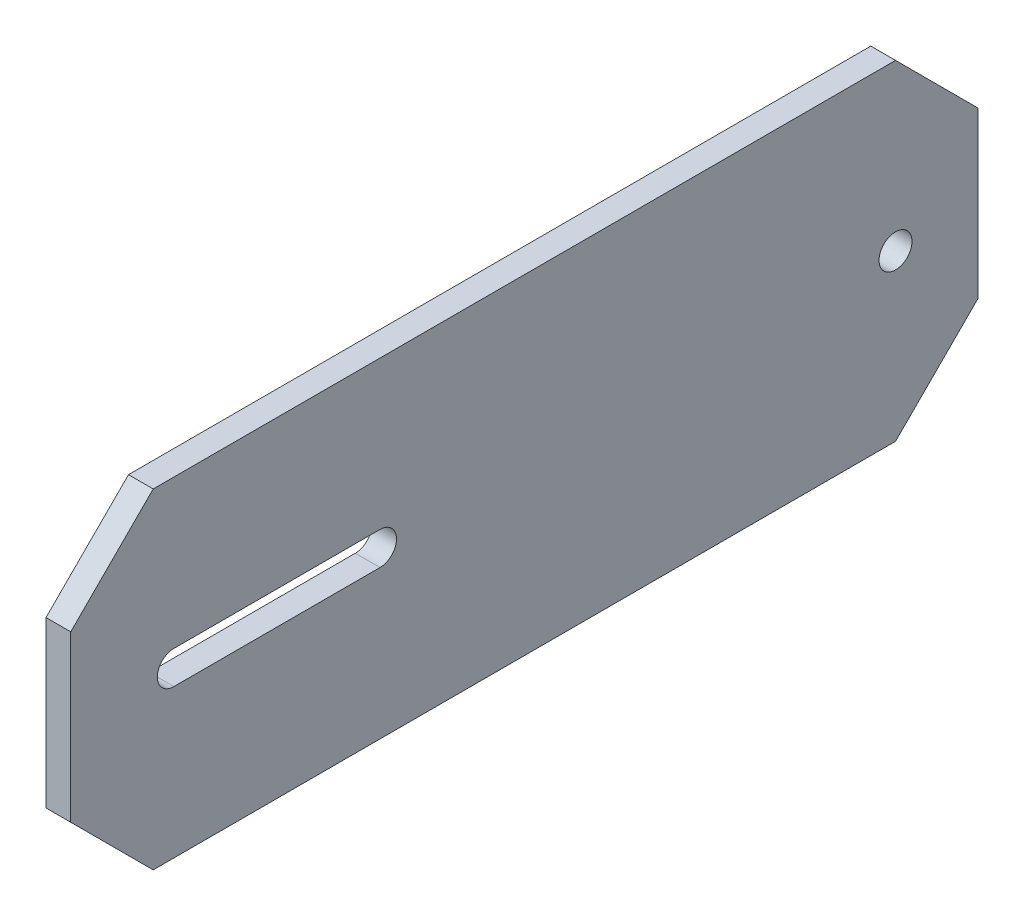
ISO-10303-21;
HEADER;
FILE_DESCRIPTION(('STEP AP214'),'2;1');
FILE_NAME('part.step','',(''),(''),'','','');
FILE_SCHEMA(('AUTOMOTIVE_DESIGN { 1 0 10303 214 1 1 1 1 }'));
ENDSEC;
DATA;
#1=APPLICATION_CONTEXT('core data for automotive mechanical design processes');
#2=APPLICATION_PROTOCOL_DEFINITION('international standard','automotive_design',2000,#1);
#3=PRODUCT_CONTEXT('',#1,'mechanical');
#4=PRODUCT('Part','Part','',(#3));
#5=PRODUCT_RELATED_PRODUCT_CATEGORY('part','',(#4));
#6=PRODUCT_DEFINITION_FORMATION('','',#4);
#7=PRODUCT_DEFINITION_CONTEXT('part definition',#1,'design');
#8=PRODUCT_DEFINITION('design','',#6,#7);
#9=PRODUCT_DEFINITION_SHAPE('','',#8);
#10=(LENGTH_UNIT() NAMED_UNIT(*) SI_UNIT(.MILLI.,.METRE.));
#11=(NAMED_UNIT(*) PLANE_ANGLE_UNIT() SI_UNIT($,.RADIAN.));
#12=(NAMED_UNIT(*) SI_UNIT($,.STERADIAN.) SOLID_ANGLE_UNIT());
#13=UNCERTAINTY_MEASURE_WITH_UNIT(LENGTH_MEASURE(1.E-05),#10,'distance_accuracy_value','');
#14=(GEOMETRIC_REPRESENTATION_CONTEXT(3) GLOBAL_UNCERTAINTY_ASSIGNED_CONTEXT((#13)) GLOBAL_UNIT_ASSIGNED_CONTEXT((#10,
#11,#12)) REPRESENTATION_CONTEXT('',''));
#15=CARTESIAN_POINT('',(0.,0.,0.));
#16=DIRECTION('',(0.,0.,1.));
#17=DIRECTION('',(1.,0.,0.));
#18=AXIS2_PLACEMENT_3D('',#15,#16,#17);
#19=CARTESIAN_POINT('',(3.,10.,9.99999999999996));
#20=DIRECTION('',(0.,0.707106781186546,-0.707106781186549));
#21=DIRECTION('',(0.,0.707106781186549,0.707106781186546));
#22=AXIS2_PLACEMENT_3D('',#19,#20,#21);
#23=PLANE('',#22);
#24=DIRECTION('',(0.,-0.707106781186549,-0.707106781186546));
#25=VECTOR('',#24,1.);
#26=CARTESIAN_POINT('',(0.,10.,9.99999999999996));
#27=LINE('',#26,#25);
#28=CARTESIAN_POINT('',(0.,10.,9.99999999999996));
#29=VERTEX_POINT('',#28);
#30=CARTESIAN_POINT('',(0.,0.,0.));
#31=VERTEX_POINT('',#30);
#32=EDGE_CURVE('E174',#29,#31,#27,.T.);
#33=ORIENTED_EDGE('',*,*,#32,.T.);
#34=DIRECTION('',(-1.,0.,0.));
#35=VECTOR('',#34,1.);
#36=CARTESIAN_POINT('',(3.,0.,0.));
#37=LINE('',#36,#35);
#38=CARTESIAN_POINT('',(3.,0.,0.));
#39=VERTEX_POINT('',#38);
#40=EDGE_CURVE('E210',#39,#31,#37,.T.);
#41=ORIENTED_EDGE('',*,*,#40,.F.);
#42=DIRECTION('',(0.,-0.707106781186549,-0.707106781186546));
#43=VECTOR('',#42,1.);
#44=CARTESIAN_POINT('',(3.,10.,9.99999999999996));
#45=LINE('',#44,#43);
#46=CARTESIAN_POINT('',(3.,10.,9.99999999999996));
#47=VERTEX_POINT('',#46);
#48=EDGE_CURVE('E155',#47,#39,#45,.T.);
#49=ORIENTED_EDGE('',*,*,#48,.F.);
#50=DIRECTION('',(-1.,0.,0.));
#51=VECTOR('',#50,1.);
#52=CARTESIAN_POINT('',(3.,10.,9.99999999999996));
#53=LINE('',#52,#51);
#54=EDGE_CURVE('E173',#47,#29,#53,.T.);
#55=ORIENTED_EDGE('',*,*,#54,.T.);
#56=EDGE_LOOP('',(#33,#41,#49,#55));
#57=FACE_BOUND('',#56,.T.);
#58=ADVANCED_FACE('F39',(#57),#23,.F.);
#59=CARTESIAN_POINT('',(3.,0.,0.));
#60=DIRECTION('',(0.,1.,0.));
#61=DIRECTION('',(0.,0.,1.));
#62=AXIS2_PLACEMENT_3D('',#59,#60,#61);
#63=PLANE('',#62);
#64=DIRECTION('',(0.,0.,-1.));
#65=VECTOR('',#64,1.);
#66=CARTESIAN_POINT('',(0.,0.,0.));
#67=LINE('',#66,#65);
#68=CARTESIAN_POINT('',(0.,0.,-90.));
#69=VERTEX_POINT('',#68);
#70=EDGE_CURVE('E177',#31,#69,#67,.T.);
#71=ORIENTED_EDGE('',*,*,#70,.T.);
#72=DIRECTION('',(-1.,0.,0.));
#73=VECTOR('',#72,1.);
#74=CARTESIAN_POINT('',(3.,0.,-90.));
#75=LINE('',#74,#73);
#76=CARTESIAN_POINT('',(3.,0.,-90.));
#77=VERTEX_POINT('',#76);
#78=EDGE_CURVE('E207',#77,#69,#75,.T.);
#79=ORIENTED_EDGE('',*,*,#78,.F.);
#80=DIRECTION('',(0.,0.,-1.));
#81=VECTOR('',#80,1.);
#82=CARTESIAN_POINT('',(3.,0.,0.));
#83=LINE('',#82,#81);
#84=EDGE_CURVE('E158',#39,#77,#83,.T.);
#85=ORIENTED_EDGE('',*,*,#84,.F.);
#86=ORIENTED_EDGE('',*,*,#40,.T.);
#87=EDGE_LOOP('',(#71,#79,#85,#86));
#88=FACE_BOUND('',#87,.T.);
#89=ADVANCED_FACE('F240',(#88),#63,.F.);
#90=CARTESIAN_POINT('',(3.,0.,-90.));
#91=DIRECTION('',(0.,0.707106781186546,0.707106781186549));
#92=DIRECTION('',(0.,-0.707106781186549,0.707106781186546));
#93=AXIS2_PLACEMENT_3D('',#90,#91,#92);
#94=PLANE('',#93);
#95=DIRECTION('',(0.,0.707106781186549,-0.707106781186546));
#96=VECTOR('',#95,1.);
#97=CARTESIAN_POINT('',(0.,0.,-90.));
#98=LINE('',#97,#96);
#99=CARTESIAN_POINT('',(0.,10.,-100.));
#100=VERTEX_POINT('',#99);
#101=EDGE_CURVE('E179',#69,#100,#98,.T.);
#102=ORIENTED_EDGE('',*,*,#101,.T.);
#103=DIRECTION('',(-1.,0.,0.));
#104=VECTOR('',#103,1.);
#105=CARTESIAN_POINT('',(3.,10.,-100.));
#106=LINE('',#105,#104);
#107=CARTESIAN_POINT('',(3.,10.,-100.));
#108=VERTEX_POINT('',#107);
#109=EDGE_CURVE('E204',#108,#100,#106,.T.);
#110=ORIENTED_EDGE('',*,*,#109,.F.);
#111=DIRECTION('',(0.,0.707106781186549,-0.707106781186546));
#112=VECTOR('',#111,1.);
#113=CARTESIAN_POINT('',(3.,0.,-90.));
#114=LINE('',#113,#112);
#115=EDGE_CURVE('E161',#77,#108,#114,.T.);
#116=ORIENTED_EDGE('',*,*,#115,.F.);
#117=ORIENTED_EDGE('',*,*,#78,.T.);
#118=EDGE_LOOP('',(#102,#110,#116,#117));
#119=FACE_BOUND('',#118,.T.);
#120=ADVANCED_FACE('F245',(#119),#94,.F.);
#121=CARTESIAN_POINT('',(3.,10.,-100.));
#122=DIRECTION('',(0.,0.,1.));
#123=DIRECTION('',(1.,0.,0.));
#124=AXIS2_PLACEMENT_3D('',#121,#122,#123);
#125=PLANE('',#124);
#126=DIRECTION('',(0.,1.,0.));
#127=VECTOR('',#126,1.);
#128=CARTESIAN_POINT('',(0.,10.,-100.));
#129=LINE('',#128,#127);
#130=CARTESIAN_POINT('',(0.,30.,-100.));
#131=VERTEX_POINT('',#130);
#132=EDGE_CURVE('E181',#100,#131,#129,.T.);
#133=ORIENTED_EDGE('',*,*,#132,.T.);
#134=DIRECTION('',(-1.,0.,0.));
#135=VECTOR('',#134,1.);
#136=CARTESIAN_POINT('',(3.,30.,-100.));
#137=LINE('',#136,#135);
#138=CARTESIAN_POINT('',(3.,30.,-100.));
#139=VERTEX_POINT('',#138);
#140=EDGE_CURVE('E201',#139,#131,#137,.T.);
#141=ORIENTED_EDGE('',*,*,#140,.F.);
#142=DIRECTION('',(0.,1.,0.));
#143=VECTOR('',#142,1.);
#144=CARTESIAN_POINT('',(3.,10.,-100.));
#145=LINE('',#144,#143);
#146=EDGE_CURVE('E163',#108,#139,#145,.T.);
#147=ORIENTED_EDGE('',*,*,#146,.F.);
#148=ORIENTED_EDGE('',*,*,#109,.T.);
#149=EDGE_LOOP('',(#133,#141,#147,#148));
#150=FACE_BOUND('',#149,.T.);
#151=ADVANCED_FACE('F277',(#150),#125,.F.);
#152=CARTESIAN_POINT('',(3.,30.,-100.));
#153=DIRECTION('',(0.,-0.707106781186546,0.707106781186549));
#154=DIRECTION('',(0.,-0.707106781186549,-0.707106781186546));
#155=AXIS2_PLACEMENT_3D('',#152,#153,#154);
#156=PLANE('',#155);
#157=DIRECTION('',(0.,0.707106781186549,0.707106781186546));
#158=VECTOR('',#157,1.);
#159=CARTESIAN_POINT('',(0.,30.,-100.));
#160=LINE('',#159,#158);
#161=CARTESIAN_POINT('',(0.,40.,-90.));
#162=VERTEX_POINT('',#161);
#163=EDGE_CURVE('E183',#131,#162,#160,.T.);
#164=ORIENTED_EDGE('',*,*,#163,.T.);
#165=DIRECTION('',(-1.,0.,0.));
#166=VECTOR('',#165,1.);
#167=CARTESIAN_POINT('',(3.,40.,-90.));
#168=LINE('',#167,#166);
#169=CARTESIAN_POINT('',(3.,40.,-90.));
#170=VERTEX_POINT('',#169);
#171=EDGE_CURVE('E198',#170,#162,#168,.T.);
#172=ORIENTED_EDGE('',*,*,#171,.F.);
#173=DIRECTION('',(0.,0.707106781186549,0.707106781186546));
#174=VECTOR('',#173,1.);
#175=CARTESIAN_POINT('',(3.,30.,-100.));
#176=LINE('',#175,#174);
#177=EDGE_CURVE('E165',#139,#170,#176,.T.);
#178=ORIENTED_EDGE('',*,*,#177,.F.);
#179=ORIENTED_EDGE('',*,*,#140,.T.);
#180=EDGE_LOOP('',(#164,#172,#178,#179));
#181=FACE_BOUND('',#180,.T.);
#182=ADVANCED_FACE('F273',(#181),#156,.F.);
#183=CARTESIAN_POINT('',(3.,40.,-90.));
#184=DIRECTION('',(0.,-1.,0.));
#185=DIRECTION('',(0.,0.,-1.));
#186=AXIS2_PLACEMENT_3D('',#183,#184,#185);
#187=PLANE('',#186);
#188=DIRECTION('',(0.,0.,1.));
#189=VECTOR('',#188,1.);
#190=CARTESIAN_POINT('',(0.,40.,-90.));
#191=LINE('',#190,#189);
#192=CARTESIAN_POINT('',(0.,40.,0.));
#193=VERTEX_POINT('',#192);
#194=EDGE_CURVE('E185',#162,#193,#191,.T.);
#195=ORIENTED_EDGE('',*,*,#194,.T.);
#196=DIRECTION('',(-1.,0.,0.));
#197=VECTOR('',#196,1.);
#198=CARTESIAN_POINT('',(3.,40.,0.));
#199=LINE('',#198,#197);
#200=CARTESIAN_POINT('',(3.,40.,0.));
#201=VERTEX_POINT('',#200);
#202=EDGE_CURVE('E195',#201,#193,#199,.T.);
#203=ORIENTED_EDGE('',*,*,#202,.F.);
#204=DIRECTION('',(0.,0.,1.));
#205=VECTOR('',#204,1.);
#206=CARTESIAN_POINT('',(3.,40.,-90.));
#207=LINE('',#206,#205);
#208=EDGE_CURVE('E167',#170,#201,#207,.T.);
#209=ORIENTED_EDGE('',*,*,#208,.F.);
#210=ORIENTED_EDGE('',*,*,#171,.T.);
#211=EDGE_LOOP('',(#195,#203,#209,#210));
#212=FACE_BOUND('',#211,.T.);
#213=ADVANCED_FACE('F268',(#212),#187,.F.);
#214=CARTESIAN_POINT('',(3.,40.,0.));
#215=DIRECTION('',(0.,-0.707106781186546,-0.707106781186549));
#216=DIRECTION('',(0.,0.707106781186549,-0.707106781186546));
#217=AXIS2_PLACEMENT_3D('',#214,#215,#216);
#218=PLANE('',#217);
#219=DIRECTION('',(0.,-0.707106781186549,0.707106781186546));
#220=VECTOR('',#219,1.);
#221=CARTESIAN_POINT('',(0.,40.,0.));
#222=LINE('',#221,#220);
#223=CARTESIAN_POINT('',(0.,30.,9.99999999999996));
#224=VERTEX_POINT('',#223);
#225=EDGE_CURVE('E187',#193,#224,#222,.T.);
#226=ORIENTED_EDGE('',*,*,#225,.T.);
#227=DIRECTION('',(-1.,0.,0.));
#228=VECTOR('',#227,1.);
#229=CARTESIAN_POINT('',(3.,30.,9.99999999999996));
#230=LINE('',#229,#228);
#231=CARTESIAN_POINT('',(3.,30.,9.99999999999996));
#232=VERTEX_POINT('',#231);
#233=EDGE_CURVE('E192',#232,#224,#230,.T.);
#234=ORIENTED_EDGE('',*,*,#233,.F.);
#235=DIRECTION('',(0.,-0.707106781186549,0.707106781186546));
#236=VECTOR('',#235,1.);
#237=CARTESIAN_POINT('',(3.,40.,0.));
#238=LINE('',#237,#236);
#239=EDGE_CURVE('E169',#201,#232,#238,.T.);
#240=ORIENTED_EDGE('',*,*,#239,.F.);
#241=ORIENTED_EDGE('',*,*,#202,.T.);
#242=EDGE_LOOP('',(#226,#234,#240,#241));
#243=FACE_BOUND('',#242,.T.);
#244=ADVANCED_FACE('F263',(#243),#218,.F.);
#245=CARTESIAN_POINT('',(3.,30.,9.99999999999996));
#246=DIRECTION('',(0.,0.,-1.));
#247=DIRECTION('',(-1.,0.,0.));
#248=AXIS2_PLACEMENT_3D('',#245,#246,#247);
#249=PLANE('',#248);
#250=DIRECTION('',(0.,-1.,0.));
#251=VECTOR('',#250,1.);
#252=CARTESIAN_POINT('',(0.,30.,9.99999999999996));
#253=LINE('',#252,#251);
#254=EDGE_CURVE('E159',#224,#29,#253,.T.);
#255=ORIENTED_EDGE('',*,*,#254,.T.);
#256=ORIENTED_EDGE('',*,*,#54,.F.);
#257=DIRECTION('',(0.,-1.,0.));
#258=VECTOR('',#257,1.);
#259=CARTESIAN_POINT('',(3.,30.,9.99999999999996));
#260=LINE('',#259,#258);
#261=EDGE_CURVE('E171',#232,#47,#260,.T.);
#262=ORIENTED_EDGE('',*,*,#261,.F.);
#263=ORIENTED_EDGE('',*,*,#233,.T.);
#264=EDGE_LOOP('',(#255,#256,#262,#263));
#265=FACE_BOUND('',#264,.T.);
#266=ADVANCED_FACE('F261',(#265),#249,.F.);
#267=CARTESIAN_POINT('',(3.,0.,0.));
#268=DIRECTION('',(1.,0.,0.));
#269=DIRECTION('',(0.,0.,-1.));
#270=AXIS2_PLACEMENT_3D('',#267,#268,#269);
#271=PLANE('',#270);
#272=CARTESIAN_POINT('',(3.,20.,-90.));
#273=DIRECTION('',(1.,0.,0.));
#274=DIRECTION('',(0.,0.,-1.));
#275=AXIS2_PLACEMENT_3D('',#272,#273,#274);
#276=CIRCLE('',#275,2.);
#277=CARTESIAN_POINT('',(3.,20.,-92.));
#278=VERTEX_POINT('',#277);
#279=EDGE_CURVE('E148',#278,#278,#276,.T.);
#280=ORIENTED_EDGE('',*,*,#279,.F.);
#281=EDGE_LOOP('',(#280));
#282=FACE_BOUND('',#281,.T.);
#283=CARTESIAN_POINT('',(3.,20.,-2.50000000000004));
#284=DIRECTION('',(1.,0.,0.));
#285=DIRECTION('',(0.,0.,1.));
#286=AXIS2_PLACEMENT_3D('',#283,#284,#285);
#287=CIRCLE('',#286,2.);
#288=CARTESIAN_POINT('',(3.,22.,-2.50000000000004));
#289=VERTEX_POINT('',#288);
#290=CARTESIAN_POINT('',(3.,18.,-2.50000000000004));
#291=VERTEX_POINT('',#290);
#292=EDGE_CURVE('E54',#289,#291,#287,.T.);
#293=ORIENTED_EDGE('',*,*,#292,.F.);
#294=DIRECTION('',(0.,0.,1.));
#295=VECTOR('',#294,1.);
#296=CARTESIAN_POINT('',(3.,22.,-2.50000000000004));
#297=LINE('',#296,#295);
#298=CARTESIAN_POINT('',(3.,22.,-27.5));
#299=VERTEX_POINT('',#298);
#300=EDGE_CURVE('E135',#299,#289,#297,.T.);
#301=ORIENTED_EDGE('',*,*,#300,.F.);
#302=CARTESIAN_POINT('',(3.,20.,-27.5));
#303=DIRECTION('',(1.,0.,0.));
#304=DIRECTION('',(0.,0.,1.));
#305=AXIS2_PLACEMENT_3D('',#302,#303,#304);
#306=CIRCLE('',#305,2.);
#307=CARTESIAN_POINT('',(3.,18.,-27.5));
#308=VERTEX_POINT('',#307);
#309=EDGE_CURVE('E141',#308,#299,#306,.T.);
#310=ORIENTED_EDGE('',*,*,#309,.F.);
#311=DIRECTION('',(0.,0.,-1.));
#312=VECTOR('',#311,1.);
#313=CARTESIAN_POINT('',(3.,18.,-2.50000000000004));
#314=LINE('',#313,#312);
#315=EDGE_CURVE('E147',#291,#308,#314,.T.);
#316=ORIENTED_EDGE('',*,*,#315,.F.);
#317=EDGE_LOOP('',(#293,#301,#310,#316));
#318=FACE_BOUND('',#317,.T.);
#319=ORIENTED_EDGE('',*,*,#48,.T.);
#320=ORIENTED_EDGE('',*,*,#84,.T.);
#321=ORIENTED_EDGE('',*,*,#115,.T.);
#322=ORIENTED_EDGE('',*,*,#146,.T.);
#323=ORIENTED_EDGE('',*,*,#177,.T.);
#324=ORIENTED_EDGE('',*,*,#208,.T.);
#325=ORIENTED_EDGE('',*,*,#239,.T.);
#326=ORIENTED_EDGE('',*,*,#261,.T.);
#327=EDGE_LOOP('',(#319,#320,#321,#322,#323,#324,#325,#326));
#328=FACE_BOUND('',#327,.T.);
#329=ADVANCED_FACE('F145',(#282,#318,#328),#271,.T.);
#330=CARTESIAN_POINT('',(0.,0.,0.));
#331=DIRECTION('',(1.,0.,0.));
#332=DIRECTION('',(0.,0.,-1.));
#333=AXIS2_PLACEMENT_3D('',#330,#331,#332);
#334=PLANE('',#333);
#335=CARTESIAN_POINT('',(0.,20.,-90.));
#336=DIRECTION('',(1.,0.,0.));
#337=DIRECTION('',(0.,0.,-1.));
#338=AXIS2_PLACEMENT_3D('',#335,#336,#337);
#339=CIRCLE('',#338,2.);
#340=CARTESIAN_POINT('',(0.,20.,-92.));
#341=VERTEX_POINT('',#340);
#342=EDGE_CURVE('E42',#341,#341,#339,.T.);
#343=ORIENTED_EDGE('',*,*,#342,.T.);
#344=EDGE_LOOP('',(#343));
#345=FACE_BOUND('',#344,.T.);
#346=DIRECTION('',(0.,0.,1.));
#347=VECTOR('',#346,1.);
#348=CARTESIAN_POINT('',(0.,22.,0.));
#349=LINE('',#348,#347);
#350=CARTESIAN_POINT('',(0.,22.,-27.5));
#351=VERTEX_POINT('',#350);
#352=CARTESIAN_POINT('',(0.,22.,-2.50000000000004));
#353=VERTEX_POINT('',#352);
#354=EDGE_CURVE('E47',#351,#353,#349,.T.);
#355=ORIENTED_EDGE('',*,*,#354,.T.);
#356=CARTESIAN_POINT('',(0.,20.,-2.50000000000004));
#357=DIRECTION('',(1.,0.,0.));
#358=DIRECTION('',(0.,0.,-1.));
#359=AXIS2_PLACEMENT_3D('',#356,#357,#358);
#360=CIRCLE('',#359,2.);
#361=CARTESIAN_POINT('',(0.,18.,-2.50000000000004));
#362=VERTEX_POINT('',#361);
#363=EDGE_CURVE('E11',#353,#362,#360,.T.);
#364=ORIENTED_EDGE('',*,*,#363,.T.);
#365=DIRECTION('',(0.,0.,-1.));
#366=VECTOR('',#365,1.);
#367=CARTESIAN_POINT('',(0.,18.,0.));
#368=LINE('',#367,#366);
#369=CARTESIAN_POINT('',(0.,18.,-27.5));
#370=VERTEX_POINT('',#369);
#371=EDGE_CURVE('E213',#362,#370,#368,.T.);
#372=ORIENTED_EDGE('',*,*,#371,.T.);
#373=CARTESIAN_POINT('',(0.,20.,-27.5));
#374=DIRECTION('',(1.,0.,0.));
#375=DIRECTION('',(0.,0.,-1.));
#376=AXIS2_PLACEMENT_3D('',#373,#374,#375);
#377=CIRCLE('',#376,2.);
#378=EDGE_CURVE('E216',#370,#351,#377,.T.);
#379=ORIENTED_EDGE('',*,*,#378,.T.);
#380=EDGE_LOOP('',(#355,#364,#372,#379));
#381=FACE_BOUND('',#380,.T.);
#382=ORIENTED_EDGE('',*,*,#32,.F.);
#383=ORIENTED_EDGE('',*,*,#254,.F.);
#384=ORIENTED_EDGE('',*,*,#225,.F.);
#385=ORIENTED_EDGE('',*,*,#194,.F.);
#386=ORIENTED_EDGE('',*,*,#163,.F.);
#387=ORIENTED_EDGE('',*,*,#132,.F.);
#388=ORIENTED_EDGE('',*,*,#101,.F.);
#389=ORIENTED_EDGE('',*,*,#70,.F.);
#390=EDGE_LOOP('',(#382,#383,#384,#385,#386,#387,#388,#389));
#391=FACE_BOUND('',#390,.T.);
#392=ADVANCED_FACE('F220',(#345,#381,#391),#334,.F.);
#393=CARTESIAN_POINT('',(-6.,20.,-2.50000000000004));
#394=DIRECTION('',(1.,0.,0.));
#395=DIRECTION('',(0.,0.,-1.));
#396=AXIS2_PLACEMENT_3D('',#393,#394,#395);
#397=CYLINDRICAL_SURFACE('',#396,2.);
#398=DIRECTION('',(1.,0.,0.));
#399=VECTOR('',#398,1.);
#400=CARTESIAN_POINT('',(-6.,22.,-2.50000000000004));
#401=LINE('',#400,#399);
#402=EDGE_CURVE('E127',#353,#289,#401,.T.);
#403=ORIENTED_EDGE('',*,*,#402,.T.);
#404=ORIENTED_EDGE('',*,*,#292,.T.);
#405=DIRECTION('',(1.,0.,0.));
#406=VECTOR('',#405,1.);
#407=CARTESIAN_POINT('',(-6.,18.,-2.50000000000004));
#408=LINE('',#407,#406);
#409=EDGE_CURVE('E142',#362,#291,#408,.T.);
#410=ORIENTED_EDGE('',*,*,#409,.F.);
#411=ORIENTED_EDGE('',*,*,#363,.F.);
#412=EDGE_LOOP('',(#403,#404,#410,#411));
#413=FACE_BOUND('',#412,.T.);
#414=ADVANCED_FACE('F129',(#413),#397,.F.);
#415=CARTESIAN_POINT('',(-6.,22.,-2.50000000000004));
#416=DIRECTION('',(0.,1.,0.));
#417=DIRECTION('',(0.,0.,1.));
#418=AXIS2_PLACEMENT_3D('',#415,#416,#417);
#419=PLANE('',#418);
#420=DIRECTION('',(1.,0.,0.));
#421=VECTOR('',#420,1.);
#422=CARTESIAN_POINT('',(-6.,22.,-27.5));
#423=LINE('',#422,#421);
#424=EDGE_CURVE('E132',#351,#299,#423,.T.);
#425=ORIENTED_EDGE('',*,*,#424,.T.);
#426=ORIENTED_EDGE('',*,*,#300,.T.);
#427=ORIENTED_EDGE('',*,*,#402,.F.);
#428=ORIENTED_EDGE('',*,*,#354,.F.);
#429=EDGE_LOOP('',(#425,#426,#427,#428));
#430=FACE_BOUND('',#429,.T.);
#431=ADVANCED_FACE('F136',(#430),#419,.F.);
#432=CARTESIAN_POINT('',(-6.,20.,-27.5));
#433=DIRECTION('',(1.,0.,0.));
#434=DIRECTION('',(0.,0.,-1.));
#435=AXIS2_PLACEMENT_3D('',#432,#433,#434);
#436=CYLINDRICAL_SURFACE('',#435,2.);
#437=DIRECTION('',(1.,0.,0.));
#438=VECTOR('',#437,1.);
#439=CARTESIAN_POINT('',(-6.,18.,-27.5));
#440=LINE('',#439,#438);
#441=EDGE_CURVE('E62',#370,#308,#440,.T.);
#442=ORIENTED_EDGE('',*,*,#441,.T.);
#443=ORIENTED_EDGE('',*,*,#309,.T.);
#444=ORIENTED_EDGE('',*,*,#424,.F.);
#445=ORIENTED_EDGE('',*,*,#378,.F.);
#446=EDGE_LOOP('',(#442,#443,#444,#445));
#447=FACE_BOUND('',#446,.T.);
#448=ADVANCED_FACE('F223',(#447),#436,.F.);
#449=CARTESIAN_POINT('',(-6.,18.,-2.50000000000004));
#450=DIRECTION('',(0.,-1.,0.));
#451=DIRECTION('',(0.,0.,-1.));
#452=AXIS2_PLACEMENT_3D('',#449,#450,#451);
#453=PLANE('',#452);
#454=ORIENTED_EDGE('',*,*,#409,.T.);
#455=ORIENTED_EDGE('',*,*,#315,.T.);
#456=ORIENTED_EDGE('',*,*,#441,.F.);
#457=ORIENTED_EDGE('',*,*,#371,.F.);
#458=EDGE_LOOP('',(#454,#455,#456,#457));
#459=FACE_BOUND('',#458,.T.);
#460=ADVANCED_FACE('F227',(#459),#453,.F.);
#461=CARTESIAN_POINT('',(-6.,20.,-90.));
#462=DIRECTION('',(1.,0.,0.));
#463=DIRECTION('',(0.,0.,-1.));
#464=AXIS2_PLACEMENT_3D('',#461,#462,#463);
#465=CYLINDRICAL_SURFACE('',#464,2.);
#466=ORIENTED_EDGE('',*,*,#279,.T.);
#467=EDGE_LOOP('',(#466));
#468=FACE_BOUND('',#467,.T.);
#469=ORIENTED_EDGE('',*,*,#342,.F.);
#470=EDGE_LOOP('',(#469));
#471=FACE_BOUND('',#470,.T.);
#472=ADVANCED_FACE('F229',(#468,#471),#465,.F.);
#473=CLOSED_SHELL('',(#58,#89,#120,#151,#182,#213,#244,#266,#329,#392,#414,#431,#448,#460,#472));
#474=MANIFOLD_SOLID_BREP('B2',#473);
#475=ADVANCED_BREP_SHAPE_REPRESENTATION('',(#18,#474),#14);
#476=SHAPE_DEFINITION_REPRESENTATION(#9,#475);
ENDSEC;
END-ISO-10303-21;
